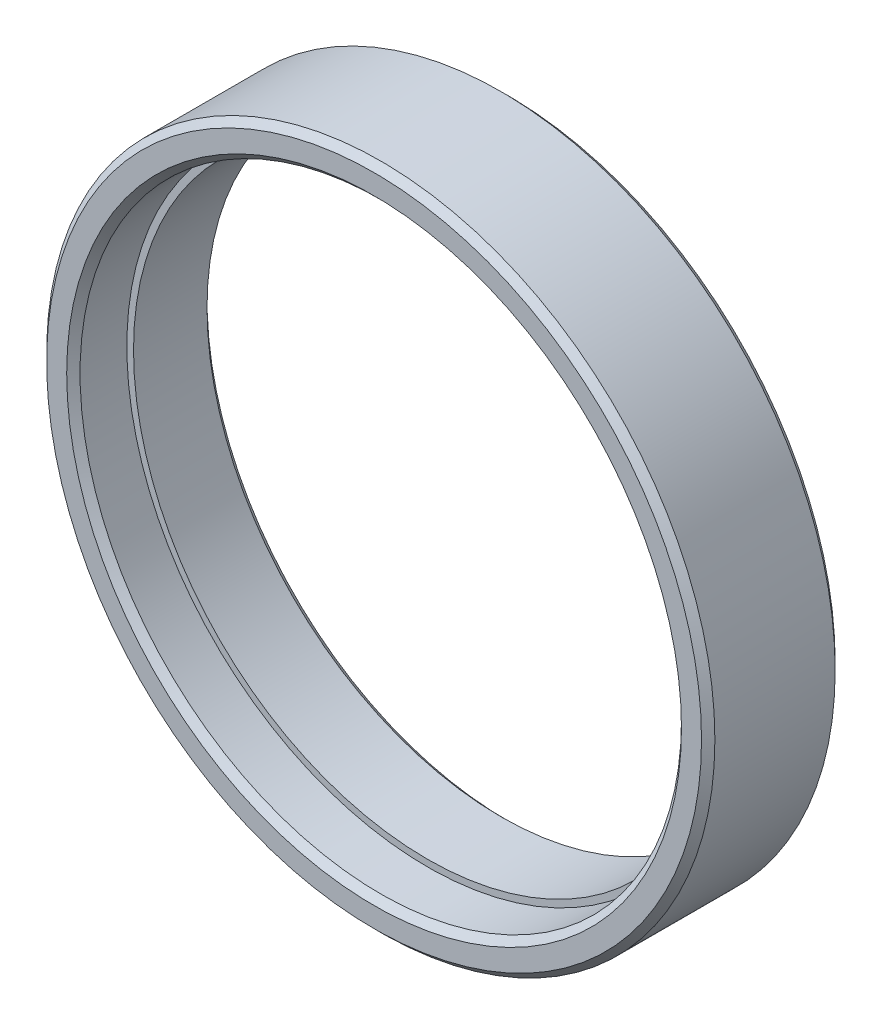
ISO-10303-21;
HEADER;
FILE_DESCRIPTION(('STEP AP214'),'2;1');
FILE_NAME('part.step','',(''),(''),'','','');
FILE_SCHEMA(('AUTOMOTIVE_DESIGN { 1 0 10303 214 1 1 1 1 }'));
ENDSEC;
DATA;
#1=APPLICATION_CONTEXT('core data for automotive mechanical design processes');
#2=APPLICATION_PROTOCOL_DEFINITION('international standard','automotive_design',2000,#1);
#3=PRODUCT_CONTEXT('',#1,'mechanical');
#4=PRODUCT('Part','Part','',(#3));
#5=PRODUCT_RELATED_PRODUCT_CATEGORY('part','',(#4));
#6=PRODUCT_DEFINITION_FORMATION('','',#4);
#7=PRODUCT_DEFINITION_CONTEXT('part definition',#1,'design');
#8=PRODUCT_DEFINITION('design','',#6,#7);
#9=PRODUCT_DEFINITION_SHAPE('','',#8);
#10=(LENGTH_UNIT() NAMED_UNIT(*) SI_UNIT(.MILLI.,.METRE.));
#11=(NAMED_UNIT(*) PLANE_ANGLE_UNIT() SI_UNIT($,.RADIAN.));
#12=(NAMED_UNIT(*) SI_UNIT($,.STERADIAN.) SOLID_ANGLE_UNIT());
#13=UNCERTAINTY_MEASURE_WITH_UNIT(LENGTH_MEASURE(1.E-05),#10,'distance_accuracy_value','');
#14=(GEOMETRIC_REPRESENTATION_CONTEXT(3) GLOBAL_UNCERTAINTY_ASSIGNED_CONTEXT((#13)) GLOBAL_UNIT_ASSIGNED_CONTEXT((#10,
#11,#12)) REPRESENTATION_CONTEXT('',''));
#15=CARTESIAN_POINT('',(0.,0.,0.));
#16=DIRECTION('',(0.,0.,1.));
#17=DIRECTION('',(1.,0.,0.));
#18=AXIS2_PLACEMENT_3D('',#15,#16,#17);
#19=CARTESIAN_POINT('',(0.,0.,20.));
#20=DIRECTION('',(0.,0.,-1.));
#21=DIRECTION('',(-1.,0.,0.));
#22=AXIS2_PLACEMENT_3D('',#19,#20,#21);
#23=CYLINDRICAL_SURFACE('',#22,50.);
#24=CARTESIAN_POINT('',(0.,0.,0.999999999999994));
#25=DIRECTION('',(0.,0.,1.));
#26=DIRECTION('',(1.,0.,0.));
#27=AXIS2_PLACEMENT_3D('',#24,#25,#26);
#28=CIRCLE('',#27,50.);
#29=CARTESIAN_POINT('',(50.,0.,0.999999999999994));
#30=VERTEX_POINT('',#29);
#31=EDGE_CURVE('E57',#30,#30,#28,.T.);
#32=ORIENTED_EDGE('',*,*,#31,.T.);
#33=EDGE_LOOP('',(#32));
#34=FACE_BOUND('',#33,.T.);
#35=CARTESIAN_POINT('',(0.,0.,19.));
#36=DIRECTION('',(0.,0.,1.));
#37=DIRECTION('',(1.,0.,0.));
#38=AXIS2_PLACEMENT_3D('',#35,#36,#37);
#39=CIRCLE('',#38,50.);
#40=CARTESIAN_POINT('',(50.,0.,19.));
#41=VERTEX_POINT('',#40);
#42=EDGE_CURVE('E63',#41,#41,#39,.F.);
#43=ORIENTED_EDGE('',*,*,#42,.T.);
#44=EDGE_LOOP('',(#43));
#45=FACE_BOUND('',#44,.T.);
#46=ADVANCED_FACE('F36',(#34,#45),#23,.T.);
#47=CARTESIAN_POINT('',(0.,0.,20.));
#48=DIRECTION('',(0.,0.,1.));
#49=DIRECTION('',(1.,0.,0.));
#50=AXIS2_PLACEMENT_3D('',#47,#48,#49);
#51=PLANE('',#50);
#52=CARTESIAN_POINT('',(0.,0.,20.));
#53=DIRECTION('',(0.,0.,1.));
#54=DIRECTION('',(1.,0.,0.));
#55=AXIS2_PLACEMENT_3D('',#52,#53,#54);
#56=CIRCLE('',#55,49.);
#57=CARTESIAN_POINT('',(49.,0.,20.));
#58=VERTEX_POINT('',#57);
#59=EDGE_CURVE('E45',#58,#58,#56,.T.);
#60=ORIENTED_EDGE('',*,*,#59,.T.);
#61=EDGE_LOOP('',(#60));
#62=FACE_BOUND('',#61,.T.);
#63=CARTESIAN_POINT('',(0.,0.,20.));
#64=DIRECTION('',(0.,0.,1.));
#65=DIRECTION('',(1.,0.,0.));
#66=AXIS2_PLACEMENT_3D('',#63,#64,#65);
#67=CIRCLE('',#66,46.);
#68=CARTESIAN_POINT('',(46.,0.,20.));
#69=VERTEX_POINT('',#68);
#70=EDGE_CURVE('E51',#69,#69,#67,.F.);
#71=ORIENTED_EDGE('',*,*,#70,.T.);
#72=EDGE_LOOP('',(#71));
#73=FACE_BOUND('',#72,.T.);
#74=ADVANCED_FACE('F107',(#62,#73),#51,.T.);
#75=CARTESIAN_POINT('',(0.,0.,0.));
#76=DIRECTION('',(0.,0.,1.));
#77=DIRECTION('',(1.,0.,0.));
#78=AXIS2_PLACEMENT_3D('',#75,#76,#77);
#79=PLANE('',#78);
#80=CARTESIAN_POINT('',(0.,0.,0.));
#81=DIRECTION('',(0.,0.,1.));
#82=DIRECTION('',(1.,0.,0.));
#83=AXIS2_PLACEMENT_3D('',#80,#81,#82);
#84=CIRCLE('',#83,45.);
#85=CARTESIAN_POINT('',(45.,0.,0.));
#86=VERTEX_POINT('',#85);
#87=EDGE_CURVE('E67',#86,#86,#84,.T.);
#88=ORIENTED_EDGE('',*,*,#87,.T.);
#89=EDGE_LOOP('',(#88));
#90=FACE_BOUND('',#89,.T.);
#91=CARTESIAN_POINT('',(0.,0.,0.));
#92=DIRECTION('',(0.,0.,1.));
#93=DIRECTION('',(1.,0.,0.));
#94=AXIS2_PLACEMENT_3D('',#91,#92,#93);
#95=CIRCLE('',#94,49.);
#96=CARTESIAN_POINT('',(49.,0.,0.));
#97=VERTEX_POINT('',#96);
#98=EDGE_CURVE('E71',#97,#97,#95,.F.);
#99=ORIENTED_EDGE('',*,*,#98,.T.);
#100=EDGE_LOOP('',(#99));
#101=FACE_BOUND('',#100,.T.);
#102=ADVANCED_FACE('F113',(#90,#101),#79,.F.);
#103=CARTESIAN_POINT('',(0.,0.,12.));
#104=DIRECTION('',(0.,0.,1.));
#105=DIRECTION('',(1.,0.,0.));
#106=AXIS2_PLACEMENT_3D('',#103,#104,#105);
#107=CYLINDRICAL_SURFACE('',#106,45.);
#108=CARTESIAN_POINT('',(0.,0.,19.));
#109=DIRECTION('',(0.,0.,1.));
#110=DIRECTION('',(1.,0.,0.));
#111=AXIS2_PLACEMENT_3D('',#108,#109,#110);
#112=CIRCLE('',#111,45.);
#113=CARTESIAN_POINT('',(45.,0.,19.));
#114=VERTEX_POINT('',#113);
#115=EDGE_CURVE('E10',#114,#114,#112,.T.);
#116=ORIENTED_EDGE('',*,*,#115,.T.);
#117=EDGE_LOOP('',(#116));
#118=FACE_BOUND('',#117,.T.);
#119=CARTESIAN_POINT('',(0.,0.,12.));
#120=DIRECTION('',(0.,0.,1.));
#121=DIRECTION('',(1.,0.,0.));
#122=AXIS2_PLACEMENT_3D('',#119,#120,#121);
#123=CIRCLE('',#122,45.);
#124=CARTESIAN_POINT('',(45.,0.,12.));
#125=VERTEX_POINT('',#124);
#126=EDGE_CURVE('E79',#125,#125,#123,.T.);
#127=ORIENTED_EDGE('',*,*,#126,.F.);
#128=EDGE_LOOP('',(#127));
#129=FACE_BOUND('',#128,.T.);
#130=ADVANCED_FACE('F104',(#118,#129),#107,.F.);
#131=CARTESIAN_POINT('',(0.,0.,12.));
#132=DIRECTION('',(0.,0.,1.));
#133=DIRECTION('',(1.,0.,0.));
#134=AXIS2_PLACEMENT_3D('',#131,#132,#133);
#135=PLANE('',#134);
#136=CARTESIAN_POINT('',(0.,0.,12.));
#137=DIRECTION('',(0.,0.,-1.));
#138=DIRECTION('',(-1.,0.,0.));
#139=AXIS2_PLACEMENT_3D('',#136,#137,#138);
#140=CIRCLE('',#139,44.);
#141=CARTESIAN_POINT('',(-44.,0.,12.));
#142=VERTEX_POINT('',#141);
#143=EDGE_CURVE('E83',#142,#142,#140,.T.);
#144=ORIENTED_EDGE('',*,*,#143,.T.);
#145=EDGE_LOOP('',(#144));
#146=FACE_BOUND('',#145,.T.);
#147=ORIENTED_EDGE('',*,*,#126,.T.);
#148=EDGE_LOOP('',(#147));
#149=FACE_BOUND('',#148,.T.);
#150=ADVANCED_FACE('F89',(#146,#149),#135,.T.);
#151=CARTESIAN_POINT('',(0.,0.,12.));
#152=DIRECTION('',(0.,0.,-1.));
#153=DIRECTION('',(-1.,0.,0.));
#154=AXIS2_PLACEMENT_3D('',#151,#152,#153);
#155=CYLINDRICAL_SURFACE('',#154,44.);
#156=CARTESIAN_POINT('',(0.,0.,0.999999999999987));
#157=DIRECTION('',(0.,0.,1.));
#158=DIRECTION('',(1.,0.,0.));
#159=AXIS2_PLACEMENT_3D('',#156,#157,#158);
#160=CIRCLE('',#159,44.);
#161=CARTESIAN_POINT('',(44.,0.,0.999999999999987));
#162=VERTEX_POINT('',#161);
#163=EDGE_CURVE('E75',#162,#162,#160,.F.);
#164=ORIENTED_EDGE('',*,*,#163,.T.);
#165=EDGE_LOOP('',(#164));
#166=FACE_BOUND('',#165,.T.);
#167=ORIENTED_EDGE('',*,*,#143,.F.);
#168=EDGE_LOOP('',(#167));
#169=FACE_BOUND('',#168,.T.);
#170=ADVANCED_FACE('F92',(#166,#169),#155,.F.);
#171=CARTESIAN_POINT('',(0.,0.,0.999999999999987));
#172=DIRECTION('',(0.,0.,-1.));
#173=DIRECTION('',(-1.,0.,0.));
#174=AXIS2_PLACEMENT_3D('',#171,#172,#173);
#175=CONICAL_SURFACE('',#174,44.,0.785398163397462);
#176=ORIENTED_EDGE('',*,*,#87,.F.);
#177=EDGE_LOOP('',(#176));
#178=FACE_BOUND('',#177,.T.);
#179=ORIENTED_EDGE('',*,*,#163,.F.);
#180=EDGE_LOOP('',(#179));
#181=FACE_BOUND('',#180,.T.);
#182=ADVANCED_FACE('F94',(#178,#181),#175,.F.);
#183=CARTESIAN_POINT('',(0.,0.,0.999999999999994));
#184=DIRECTION('',(0.,0.,1.));
#185=DIRECTION('',(1.,0.,0.));
#186=AXIS2_PLACEMENT_3D('',#183,#184,#185);
#187=CONICAL_SURFACE('',#186,50.,0.785398163397452);
#188=ORIENTED_EDGE('',*,*,#98,.F.);
#189=EDGE_LOOP('',(#188));
#190=FACE_BOUND('',#189,.T.);
#191=ORIENTED_EDGE('',*,*,#31,.F.);
#192=EDGE_LOOP('',(#191));
#193=FACE_BOUND('',#192,.T.);
#194=ADVANCED_FACE('F101',(#190,#193),#187,.T.);
#195=CARTESIAN_POINT('',(0.,0.,20.));
#196=DIRECTION('',(0.,0.,-1.));
#197=DIRECTION('',(-1.,0.,0.));
#198=AXIS2_PLACEMENT_3D('',#195,#196,#197);
#199=CONICAL_SURFACE('',#198,49.,0.785398163397438);
#200=ORIENTED_EDGE('',*,*,#42,.F.);
#201=EDGE_LOOP('',(#200));
#202=FACE_BOUND('',#201,.T.);
#203=ORIENTED_EDGE('',*,*,#59,.F.);
#204=EDGE_LOOP('',(#203));
#205=FACE_BOUND('',#204,.T.);
#206=ADVANCED_FACE('F126',(#202,#205),#199,.T.);
#207=CARTESIAN_POINT('',(0.,0.,19.));
#208=DIRECTION('',(0.,0.,1.));
#209=DIRECTION('',(1.,0.,0.));
#210=AXIS2_PLACEMENT_3D('',#207,#208,#209);
#211=CONICAL_SURFACE('',#210,45.,0.785398163397441);
#212=ORIENTED_EDGE('',*,*,#70,.F.);
#213=EDGE_LOOP('',(#212));
#214=FACE_BOUND('',#213,.T.);
#215=ORIENTED_EDGE('',*,*,#115,.F.);
#216=EDGE_LOOP('',(#215));
#217=FACE_BOUND('',#216,.T.);
#218=ADVANCED_FACE('F39',(#214,#217),#211,.F.);
#219=CLOSED_SHELL('',(#46,#74,#102,#130,#150,#170,#182,#194,#206,#218));
#220=MANIFOLD_SOLID_BREP('B2',#219);
#221=ADVANCED_BREP_SHAPE_REPRESENTATION('',(#18,#220),#14);
#222=SHAPE_DEFINITION_REPRESENTATION(#9,#221);
ENDSEC;
END-ISO-10303-21;
